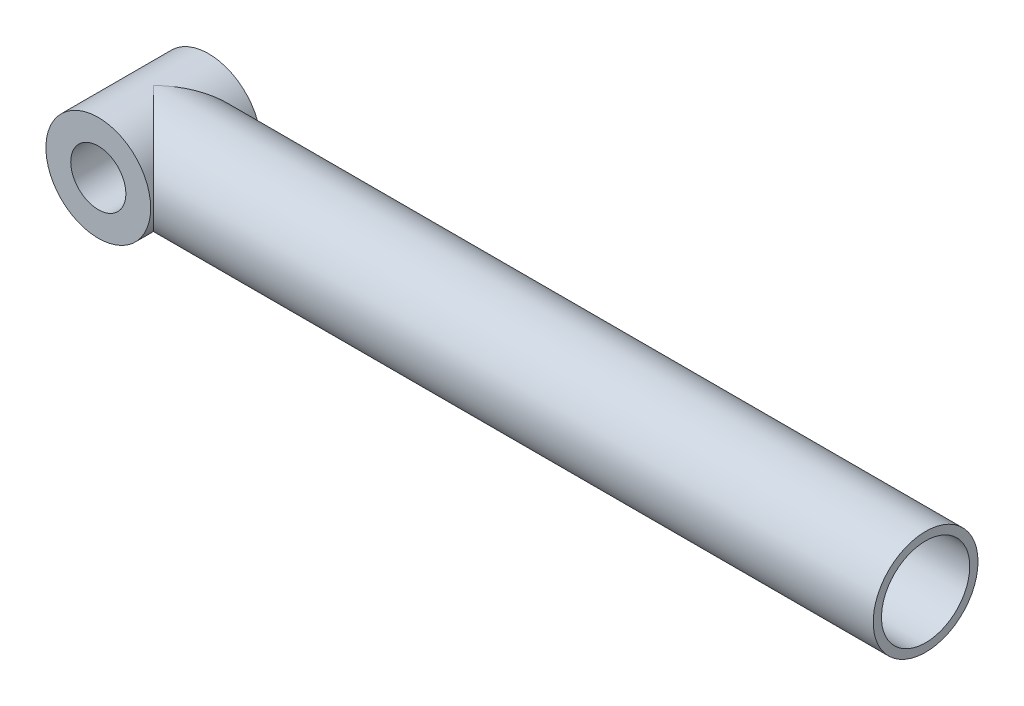
ISO-10303-21;
HEADER;
FILE_DESCRIPTION(('STEP AP214'),'2;1');
FILE_NAME('part.step','',(''),(''),'','','');
FILE_SCHEMA(('AUTOMOTIVE_DESIGN { 1 0 10303 214 1 1 1 1 }'));
ENDSEC;
DATA;
#1=APPLICATION_CONTEXT('core data for automotive mechanical design processes');
#2=APPLICATION_PROTOCOL_DEFINITION('international standard','automotive_design',2000,#1);
#3=PRODUCT_CONTEXT('',#1,'mechanical');
#4=PRODUCT('Part','Part','',(#3));
#5=PRODUCT_RELATED_PRODUCT_CATEGORY('part','',(#4));
#6=PRODUCT_DEFINITION_FORMATION('','',#4);
#7=PRODUCT_DEFINITION_CONTEXT('part definition',#1,'design');
#8=PRODUCT_DEFINITION('design','',#6,#7);
#9=PRODUCT_DEFINITION_SHAPE('','',#8);
#10=(LENGTH_UNIT() NAMED_UNIT(*) SI_UNIT(.MILLI.,.METRE.));
#11=(NAMED_UNIT(*) PLANE_ANGLE_UNIT() SI_UNIT($,.RADIAN.));
#12=(NAMED_UNIT(*) SI_UNIT($,.STERADIAN.) SOLID_ANGLE_UNIT());
#13=UNCERTAINTY_MEASURE_WITH_UNIT(LENGTH_MEASURE(1.E-05),#10,'distance_accuracy_value','');
#14=(GEOMETRIC_REPRESENTATION_CONTEXT(3) GLOBAL_UNCERTAINTY_ASSIGNED_CONTEXT((#13)) GLOBAL_UNIT_ASSIGNED_CONTEXT((#10,
#11,#12)) REPRESENTATION_CONTEXT('',''));
#15=CARTESIAN_POINT('',(0.,0.,0.));
#16=DIRECTION('',(0.,0.,1.));
#17=DIRECTION('',(1.,0.,0.));
#18=AXIS2_PLACEMENT_3D('',#15,#16,#17);
#19=CARTESIAN_POINT('',(0.,0.,100.));
#20=DIRECTION('',(0.,0.,-1.));
#21=DIRECTION('',(-1.,0.,0.));
#22=AXIS2_PLACEMENT_3D('',#19,#20,#21);
#23=CYLINDRICAL_SURFACE('',#22,47.5);
#24=CARTESIAN_POINT('',(0.,0.,50.));
#25=DIRECTION('',(0.707106781186547,0.,0.707106781186547));
#26=DIRECTION('',(0.707106781186547,0.,-0.707106781186547));
#27=AXIS2_PLACEMENT_3D('',#24,#25,#26);
#28=ELLIPSE('',#27,67.175144212722,47.5);
#29=CARTESIAN_POINT('',(0.,-47.5,50.));
#30=VERTEX_POINT('',#29);
#31=CARTESIAN_POINT('',(0.,47.5,50.));
#32=VERTEX_POINT('',#31);
#33=EDGE_CURVE('E52',#30,#32,#28,.T.);
#34=ORIENTED_EDGE('',*,*,#33,.F.);
#35=CARTESIAN_POINT('',(0.,0.,50.));
#36=DIRECTION('',(0.707106781186547,0.,-0.707106781186547));
#37=DIRECTION('',(0.707106781186547,0.,0.707106781186547));
#38=AXIS2_PLACEMENT_3D('',#35,#36,#37);
#39=ELLIPSE('',#38,67.175144212722,47.5);
#40=EDGE_CURVE('E50',#32,#30,#39,.T.);
#41=ORIENTED_EDGE('',*,*,#40,.F.);
#42=EDGE_LOOP('',(#34,#41));
#43=FACE_BOUND('',#42,.T.);
#44=CARTESIAN_POINT('',(0.,0.,100.));
#45=DIRECTION('',(0.,0.,1.));
#46=DIRECTION('',(1.,0.,0.));
#47=AXIS2_PLACEMENT_3D('',#44,#45,#46);
#48=CIRCLE('',#47,47.5);
#49=CARTESIAN_POINT('',(47.5,0.,100.));
#50=VERTEX_POINT('',#49);
#51=EDGE_CURVE('E11',#50,#50,#48,.T.);
#52=ORIENTED_EDGE('',*,*,#51,.F.);
#53=EDGE_LOOP('',(#52));
#54=FACE_BOUND('',#53,.T.);
#55=CARTESIAN_POINT('',(0.,0.,0.));
#56=DIRECTION('',(0.,0.,1.));
#57=DIRECTION('',(1.,0.,0.));
#58=AXIS2_PLACEMENT_3D('',#55,#56,#57);
#59=CIRCLE('',#58,47.5);
#60=CARTESIAN_POINT('',(47.5,0.,0.));
#61=VERTEX_POINT('',#60);
#62=EDGE_CURVE('E40',#61,#61,#59,.T.);
#63=ORIENTED_EDGE('',*,*,#62,.T.);
#64=EDGE_LOOP('',(#63));
#65=FACE_BOUND('',#64,.T.);
#66=ADVANCED_FACE('F37',(#43,#54,#65),#23,.T.);
#67=CARTESIAN_POINT('',(0.,0.,100.));
#68=DIRECTION('',(0.,0.,1.));
#69=DIRECTION('',(1.,0.,0.));
#70=AXIS2_PLACEMENT_3D('',#67,#68,#69);
#71=PLANE('',#70);
#72=CARTESIAN_POINT('',(0.,0.,100.));
#73=DIRECTION('',(0.,0.,1.));
#74=DIRECTION('',(1.,0.,0.));
#75=AXIS2_PLACEMENT_3D('',#72,#73,#74);
#76=CIRCLE('',#75,25.);
#77=CARTESIAN_POINT('',(25.,0.,100.));
#78=VERTEX_POINT('',#77);
#79=EDGE_CURVE('E69',#78,#78,#76,.F.);
#80=ORIENTED_EDGE('',*,*,#79,.T.);
#81=EDGE_LOOP('',(#80));
#82=FACE_BOUND('',#81,.T.);
#83=ORIENTED_EDGE('',*,*,#51,.T.);
#84=EDGE_LOOP('',(#83));
#85=FACE_BOUND('',#84,.T.);
#86=ADVANCED_FACE('F85',(#82,#85),#71,.T.);
#87=CARTESIAN_POINT('',(0.,0.,0.));
#88=DIRECTION('',(0.,0.,1.));
#89=DIRECTION('',(1.,0.,0.));
#90=AXIS2_PLACEMENT_3D('',#87,#88,#89);
#91=PLANE('',#90);
#92=CARTESIAN_POINT('',(0.,0.,0.));
#93=DIRECTION('',(0.,0.,-1.));
#94=DIRECTION('',(-1.,0.,0.));
#95=AXIS2_PLACEMENT_3D('',#92,#93,#94);
#96=CIRCLE('',#95,25.);
#97=CARTESIAN_POINT('',(-25.,0.,0.));
#98=VERTEX_POINT('',#97);
#99=EDGE_CURVE('E73',#98,#98,#96,.T.);
#100=ORIENTED_EDGE('',*,*,#99,.F.);
#101=EDGE_LOOP('',(#100));
#102=FACE_BOUND('',#101,.T.);
#103=ORIENTED_EDGE('',*,*,#62,.F.);
#104=EDGE_LOOP('',(#103));
#105=FACE_BOUND('',#104,.T.);
#106=ADVANCED_FACE('F82',(#102,#105),#91,.F.);
#107=CARTESIAN_POINT('',(-47.501,0.,50.));
#108=DIRECTION('',(1.,0.,0.));
#109=DIRECTION('',(0.,0.,-1.));
#110=AXIS2_PLACEMENT_3D('',#107,#108,#109);
#111=CYLINDRICAL_SURFACE('',#110,47.5);
#112=CARTESIAN_POINT('',(700.,0.,50.));
#113=DIRECTION('',(1.,0.,0.));
#114=DIRECTION('',(0.,0.,-1.));
#115=AXIS2_PLACEMENT_3D('',#112,#113,#114);
#116=CIRCLE('',#115,47.5);
#117=CARTESIAN_POINT('',(700.,0.,2.5));
#118=VERTEX_POINT('',#117);
#119=EDGE_CURVE('E57',#118,#118,#116,.T.);
#120=ORIENTED_EDGE('',*,*,#119,.F.);
#121=EDGE_LOOP('',(#120));
#122=FACE_BOUND('',#121,.T.);
#123=ORIENTED_EDGE('',*,*,#33,.T.);
#124=ORIENTED_EDGE('',*,*,#40,.T.);
#125=EDGE_LOOP('',(#123,#124));
#126=FACE_BOUND('',#125,.T.);
#127=ADVANCED_FACE('F53',(#122,#126),#111,.T.);
#128=CARTESIAN_POINT('',(700.,0.,50.));
#129=DIRECTION('',(1.,0.,0.));
#130=DIRECTION('',(0.,0.,-1.));
#131=AXIS2_PLACEMENT_3D('',#128,#129,#130);
#132=PLANE('',#131);
#133=CARTESIAN_POINT('',(700.,0.,50.));
#134=DIRECTION('',(1.,0.,0.));
#135=DIRECTION('',(0.,0.,-1.));
#136=AXIS2_PLACEMENT_3D('',#133,#134,#135);
#137=CIRCLE('',#136,40.);
#138=CARTESIAN_POINT('',(700.,0.,10.));
#139=VERTEX_POINT('',#138);
#140=EDGE_CURVE('E60',#139,#139,#137,.T.);
#141=ORIENTED_EDGE('',*,*,#140,.F.);
#142=EDGE_LOOP('',(#141));
#143=FACE_BOUND('',#142,.T.);
#144=ORIENTED_EDGE('',*,*,#119,.T.);
#145=EDGE_LOOP('',(#144));
#146=FACE_BOUND('',#145,.T.);
#147=ADVANCED_FACE('F101',(#143,#146),#132,.T.);
#148=CARTESIAN_POINT('',(-47.501,0.,50.));
#149=DIRECTION('',(1.,0.,0.));
#150=DIRECTION('',(0.,0.,-1.));
#151=AXIS2_PLACEMENT_3D('',#148,#149,#150);
#152=CYLINDRICAL_SURFACE('',#151,40.);
#153=CARTESIAN_POINT('',(50.,0.,50.));
#154=DIRECTION('',(1.,0.,0.));
#155=DIRECTION('',(0.,0.,-1.));
#156=AXIS2_PLACEMENT_3D('',#153,#154,#155);
#157=CIRCLE('',#156,40.);
#158=CARTESIAN_POINT('',(50.,0.,10.));
#159=VERTEX_POINT('',#158);
#160=EDGE_CURVE('E65',#159,#159,#157,.T.);
#161=ORIENTED_EDGE('',*,*,#160,.F.);
#162=EDGE_LOOP('',(#161));
#163=FACE_BOUND('',#162,.T.);
#164=ORIENTED_EDGE('',*,*,#140,.T.);
#165=EDGE_LOOP('',(#164));
#166=FACE_BOUND('',#165,.T.);
#167=ADVANCED_FACE('F105',(#163,#166),#152,.F.);
#168=CARTESIAN_POINT('',(50.,0.,50.));
#169=DIRECTION('',(1.,0.,0.));
#170=DIRECTION('',(0.,0.,-1.));
#171=AXIS2_PLACEMENT_3D('',#168,#169,#170);
#172=PLANE('',#171);
#173=ORIENTED_EDGE('',*,*,#160,.T.);
#174=EDGE_LOOP('',(#173));
#175=FACE_BOUND('',#174,.T.);
#176=ADVANCED_FACE('F109',(#175),#172,.T.);
#177=CARTESIAN_POINT('',(0.,0.,170.710678118655));
#178=DIRECTION('',(0.,0.,-1.));
#179=DIRECTION('',(-1.,0.,0.));
#180=AXIS2_PLACEMENT_3D('',#177,#178,#179);
#181=CYLINDRICAL_SURFACE('',#180,25.);
#182=ORIENTED_EDGE('',*,*,#99,.T.);
#183=EDGE_LOOP('',(#182));
#184=FACE_BOUND('',#183,.T.);
#185=ORIENTED_EDGE('',*,*,#79,.F.);
#186=EDGE_LOOP('',(#185));
#187=FACE_BOUND('',#186,.T.);
#188=ADVANCED_FACE('F79',(#184,#187),#181,.F.);
#189=CLOSED_SHELL('',(#66,#86,#106,#127,#147,#167,#176,#188));
#190=MANIFOLD_SOLID_BREP('B2',#189);
#191=ADVANCED_BREP_SHAPE_REPRESENTATION('',(#18,#190),#14);
#192=SHAPE_DEFINITION_REPRESENTATION(#9,#191);
ENDSEC;
END-ISO-10303-21;
